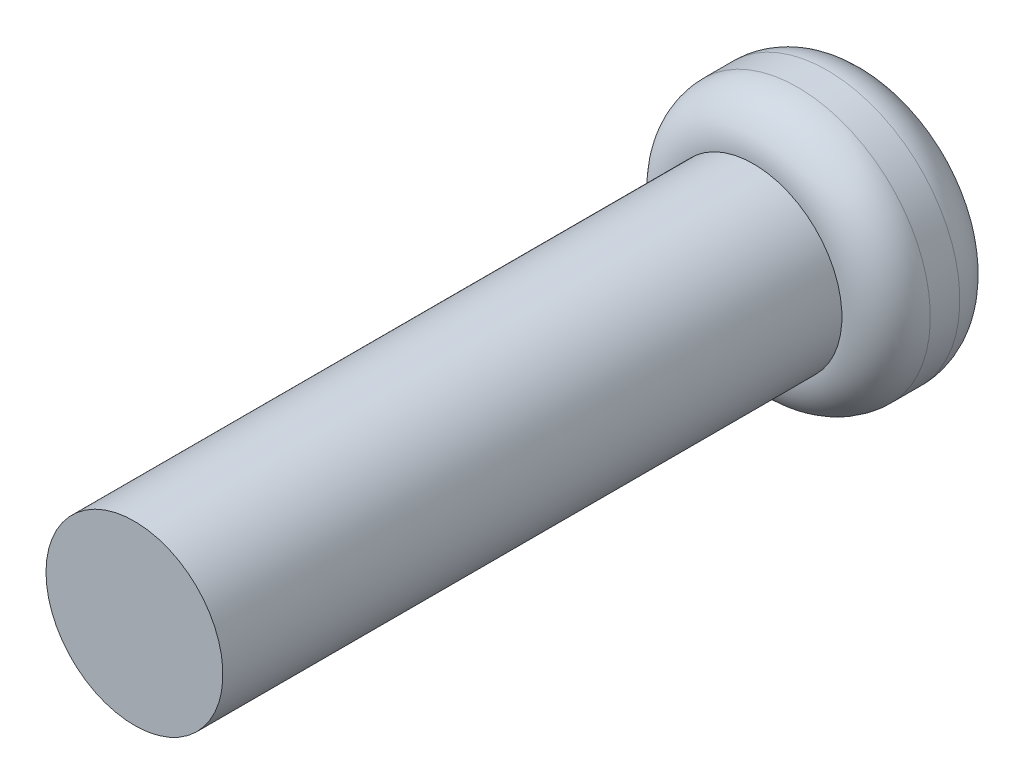
ISO-10303-21;
HEADER;
FILE_DESCRIPTION(('STEP AP214'),'2;1');
FILE_NAME('part.step','',(''),(''),'','','');
FILE_SCHEMA(('AUTOMOTIVE_DESIGN { 1 0 10303 214 1 1 1 1 }'));
ENDSEC;
DATA;
#1=APPLICATION_CONTEXT('core data for automotive mechanical design processes');
#2=APPLICATION_PROTOCOL_DEFINITION('international standard','automotive_design',2000,#1);
#3=PRODUCT_CONTEXT('',#1,'mechanical');
#4=PRODUCT('Part','Part','',(#3));
#5=PRODUCT_RELATED_PRODUCT_CATEGORY('part','',(#4));
#6=PRODUCT_DEFINITION_FORMATION('','',#4);
#7=PRODUCT_DEFINITION_CONTEXT('part definition',#1,'design');
#8=PRODUCT_DEFINITION('design','',#6,#7);
#9=PRODUCT_DEFINITION_SHAPE('','',#8);
#10=(LENGTH_UNIT() NAMED_UNIT(*) SI_UNIT(.MILLI.,.METRE.));
#11=(NAMED_UNIT(*) PLANE_ANGLE_UNIT() SI_UNIT($,.RADIAN.));
#12=(NAMED_UNIT(*) SI_UNIT($,.STERADIAN.) SOLID_ANGLE_UNIT());
#13=UNCERTAINTY_MEASURE_WITH_UNIT(LENGTH_MEASURE(1.E-05),#10,'distance_accuracy_value','');
#14=(GEOMETRIC_REPRESENTATION_CONTEXT(3) GLOBAL_UNCERTAINTY_ASSIGNED_CONTEXT((#13)) GLOBAL_UNIT_ASSIGNED_CONTEXT((#10,
#11,#12)) REPRESENTATION_CONTEXT('',''));
#15=CARTESIAN_POINT('',(0.,0.,0.));
#16=DIRECTION('',(0.,0.,1.));
#17=DIRECTION('',(1.,0.,0.));
#18=AXIS2_PLACEMENT_3D('',#15,#16,#17);
#19=CARTESIAN_POINT('',(0.,0.,0.));
#20=DIRECTION('',(0.,0.,-1.));
#21=DIRECTION('',(-1.,0.,0.));
#22=AXIS2_PLACEMENT_3D('',#19,#20,#21);
#23=CYLINDRICAL_SURFACE('',#22,3.);
#24=CARTESIAN_POINT('',(0.,0.,0.));
#25=DIRECTION('',(0.,0.,-1.));
#26=DIRECTION('',(-1.,0.,0.));
#27=AXIS2_PLACEMENT_3D('',#24,#25,#26);
#28=CIRCLE('',#27,3.);
#29=CARTESIAN_POINT('',(-3.,0.,0.));
#30=VERTEX_POINT('',#29);
#31=EDGE_CURVE('E29',#30,#30,#28,.T.);
#32=ORIENTED_EDGE('',*,*,#31,.T.);
#33=EDGE_LOOP('',(#32));
#34=FACE_BOUND('',#33,.T.);
#35=CARTESIAN_POINT('',(0.,0.,-21.));
#36=DIRECTION('',(0.,0.,-1.));
#37=DIRECTION('',(-1.,0.,0.));
#38=AXIS2_PLACEMENT_3D('',#35,#36,#37);
#39=CIRCLE('',#38,3.);
#40=CARTESIAN_POINT('',(-3.,0.,-21.));
#41=VERTEX_POINT('',#40);
#42=EDGE_CURVE('E34',#41,#41,#39,.T.);
#43=ORIENTED_EDGE('',*,*,#42,.F.);
#44=EDGE_LOOP('',(#43));
#45=FACE_BOUND('',#44,.T.);
#46=ADVANCED_FACE('F14',(#34,#45),#23,.T.);
#47=CARTESIAN_POINT('',(0.,0.,0.));
#48=DIRECTION('',(0.,0.,-1.));
#49=DIRECTION('',(-1.,0.,0.));
#50=AXIS2_PLACEMENT_3D('',#47,#48,#49);
#51=PLANE('',#50);
#52=ORIENTED_EDGE('',*,*,#31,.F.);
#53=EDGE_LOOP('',(#52));
#54=FACE_BOUND('',#53,.T.);
#55=ADVANCED_FACE('F42',(#54),#51,.F.);
#56=CARTESIAN_POINT('',(0.,0.,-25.));
#57=DIRECTION('',(0.,0.,1.));
#58=DIRECTION('',(1.,0.,0.));
#59=AXIS2_PLACEMENT_3D('',#56,#57,#58);
#60=CYLINDRICAL_SURFACE('',#59,4.5);
#61=CARTESIAN_POINT('',(0.,0.,-22.5));
#62=DIRECTION('',(0.,0.,-1.));
#63=DIRECTION('',(-1.,0.,0.));
#64=AXIS2_PLACEMENT_3D('',#61,#62,#63);
#65=CIRCLE('',#64,4.5);
#66=CARTESIAN_POINT('',(-4.5,0.,-22.5));
#67=VERTEX_POINT('',#66);
#68=EDGE_CURVE('E21',#67,#67,#65,.T.);
#69=ORIENTED_EDGE('',*,*,#68,.T.);
#70=EDGE_LOOP('',(#69));
#71=FACE_BOUND('',#70,.T.);
#72=CARTESIAN_POINT('',(0.,0.,-23.5));
#73=DIRECTION('',(0.,0.,-1.));
#74=DIRECTION('',(-1.,0.,0.));
#75=AXIS2_PLACEMENT_3D('',#72,#73,#74);
#76=CIRCLE('',#75,4.5);
#77=CARTESIAN_POINT('',(-4.5,0.,-23.5));
#78=VERTEX_POINT('',#77);
#79=EDGE_CURVE('E25',#78,#78,#76,.F.);
#80=ORIENTED_EDGE('',*,*,#79,.T.);
#81=EDGE_LOOP('',(#80));
#82=FACE_BOUND('',#81,.T.);
#83=ADVANCED_FACE('F50',(#71,#82),#60,.T.);
#84=CARTESIAN_POINT('',(0.,0.,-25.));
#85=DIRECTION('',(0.,0.,-1.));
#86=DIRECTION('',(-1.,0.,0.));
#87=AXIS2_PLACEMENT_3D('',#84,#85,#86);
#88=PLANE('',#87);
#89=CARTESIAN_POINT('',(0.,0.,-25.));
#90=DIRECTION('',(0.,0.,-1.));
#91=DIRECTION('',(-1.,0.,0.));
#92=AXIS2_PLACEMENT_3D('',#89,#90,#91);
#93=CIRCLE('',#92,3.);
#94=CARTESIAN_POINT('',(-3.,0.,-25.));
#95=VERTEX_POINT('',#94);
#96=EDGE_CURVE('E10',#95,#95,#93,.T.);
#97=ORIENTED_EDGE('',*,*,#96,.T.);
#98=EDGE_LOOP('',(#97));
#99=FACE_BOUND('',#98,.T.);
#100=ADVANCED_FACE('F55',(#99),#88,.T.);
#101=CARTESIAN_POINT('',(0.,0.,-22.5));
#102=DIRECTION('',(0.,0.,-1.));
#103=DIRECTION('',(-1.,0.,0.));
#104=AXIS2_PLACEMENT_3D('',#101,#102,#103);
#105=TOROIDAL_SURFACE('',#104,3.,1.5);
#106=ORIENTED_EDGE('',*,*,#42,.T.);
#107=EDGE_LOOP('',(#106));
#108=FACE_BOUND('',#107,.T.);
#109=ORIENTED_EDGE('',*,*,#68,.F.);
#110=EDGE_LOOP('',(#109));
#111=FACE_BOUND('',#110,.T.);
#112=ADVANCED_FACE('F38',(#108,#111),#105,.T.);
#113=CARTESIAN_POINT('',(0.,0.,-23.5));
#114=DIRECTION('',(0.,0.,-1.));
#115=DIRECTION('',(-1.,0.,0.));
#116=AXIS2_PLACEMENT_3D('',#113,#114,#115);
#117=TOROIDAL_SURFACE('',#116,3.,1.5);
#118=ORIENTED_EDGE('',*,*,#79,.F.);
#119=EDGE_LOOP('',(#118));
#120=FACE_BOUND('',#119,.T.);
#121=ORIENTED_EDGE('',*,*,#96,.F.);
#122=EDGE_LOOP('',(#121));
#123=FACE_BOUND('',#122,.T.);
#124=ADVANCED_FACE('F16',(#120,#123),#117,.T.);
#125=CLOSED_SHELL('',(#46,#55,#83,#100,#112,#124));
#126=MANIFOLD_SOLID_BREP('B1',#125);
#127=ADVANCED_BREP_SHAPE_REPRESENTATION('',(#18,#126),#14);
#128=SHAPE_DEFINITION_REPRESENTATION(#9,#127);
ENDSEC;
END-ISO-10303-21;
